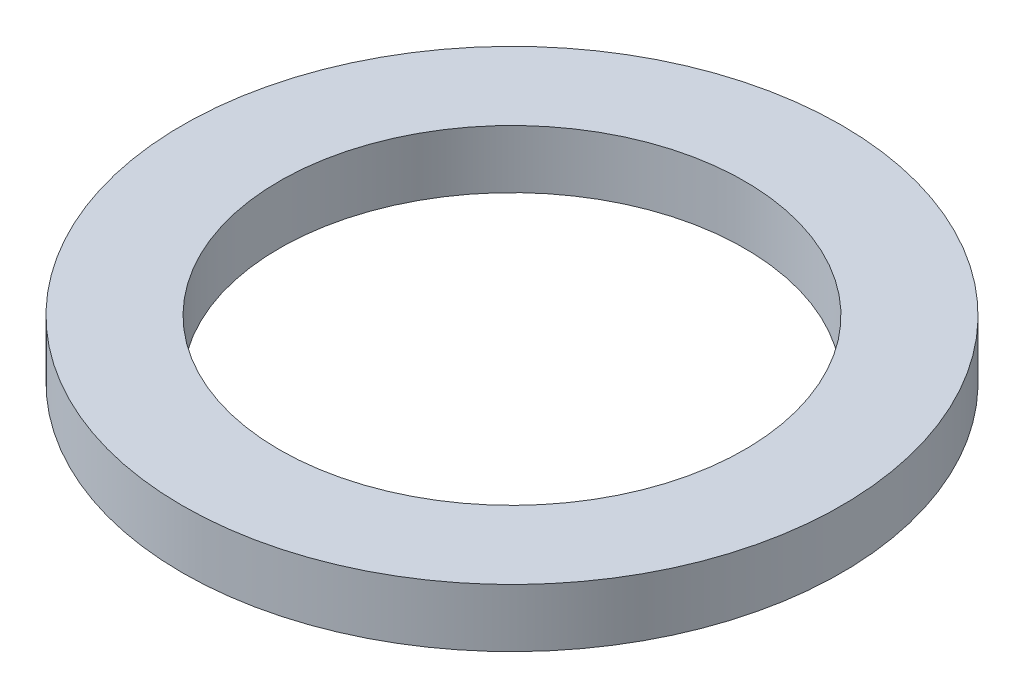
ISO-10303-21;
HEADER;
FILE_DESCRIPTION(('STEP AP214'),'2;1');
FILE_NAME('part.step','',(''),(''),'','','');
FILE_SCHEMA(('AUTOMOTIVE_DESIGN { 1 0 10303 214 1 1 1 1 }'));
ENDSEC;
DATA;
#1=APPLICATION_CONTEXT('core data for automotive mechanical design processes');
#2=APPLICATION_PROTOCOL_DEFINITION('international standard','automotive_design',2000,#1);
#3=PRODUCT_CONTEXT('',#1,'mechanical');
#4=PRODUCT('Part','Part','',(#3));
#5=PRODUCT_RELATED_PRODUCT_CATEGORY('part','',(#4));
#6=PRODUCT_DEFINITION_FORMATION('','',#4);
#7=PRODUCT_DEFINITION_CONTEXT('part definition',#1,'design');
#8=PRODUCT_DEFINITION('design','',#6,#7);
#9=PRODUCT_DEFINITION_SHAPE('','',#8);
#10=(LENGTH_UNIT() NAMED_UNIT(*) SI_UNIT(.MILLI.,.METRE.));
#11=(NAMED_UNIT(*) PLANE_ANGLE_UNIT() SI_UNIT($,.RADIAN.));
#12=(NAMED_UNIT(*) SI_UNIT($,.STERADIAN.) SOLID_ANGLE_UNIT());
#13=UNCERTAINTY_MEASURE_WITH_UNIT(LENGTH_MEASURE(1.E-05),#10,'distance_accuracy_value','');
#14=(GEOMETRIC_REPRESENTATION_CONTEXT(3) GLOBAL_UNCERTAINTY_ASSIGNED_CONTEXT((#13)) GLOBAL_UNIT_ASSIGNED_CONTEXT((#10,
#11,#12)) REPRESENTATION_CONTEXT('',''));
#15=CARTESIAN_POINT('',(0.,0.,0.));
#16=DIRECTION('',(0.,0.,1.));
#17=DIRECTION('',(1.,0.,0.));
#18=AXIS2_PLACEMENT_3D('',#15,#16,#17);
#19=CARTESIAN_POINT('',(0.,1.5,0.));
#20=DIRECTION('',(0.,1.,0.));
#21=DIRECTION('',(0.,0.,1.));
#22=AXIS2_PLACEMENT_3D('',#19,#20,#21);
#23=PLANE('',#22);
#24=CARTESIAN_POINT('',(0.,1.5,0.));
#25=DIRECTION('',(0.,1.,0.));
#26=DIRECTION('',(0.,0.,1.));
#27=AXIS2_PLACEMENT_3D('',#24,#25,#26);
#28=CIRCLE('',#27,8.5);
#29=CARTESIAN_POINT('',(0.,1.5,8.5));
#30=VERTEX_POINT('',#29);
#31=EDGE_CURVE('E10',#30,#30,#28,.T.);
#32=ORIENTED_EDGE('',*,*,#31,.T.);
#33=EDGE_LOOP('',(#32));
#34=FACE_BOUND('',#33,.T.);
#35=CARTESIAN_POINT('',(0.,1.5,0.));
#36=DIRECTION('',(0.,1.,0.));
#37=DIRECTION('',(0.,0.,1.));
#38=AXIS2_PLACEMENT_3D('',#35,#36,#37);
#39=CIRCLE('',#38,6.);
#40=CARTESIAN_POINT('',(0.,1.5,6.));
#41=VERTEX_POINT('',#40);
#42=EDGE_CURVE('E50',#41,#41,#39,.T.);
#43=ORIENTED_EDGE('',*,*,#42,.F.);
#44=EDGE_LOOP('',(#43));
#45=FACE_BOUND('',#44,.T.);
#46=ADVANCED_FACE('F37',(#34,#45),#23,.T.);
#47=CARTESIAN_POINT('',(0.,0.,0.));
#48=DIRECTION('',(0.,1.,0.));
#49=DIRECTION('',(0.,0.,1.));
#50=AXIS2_PLACEMENT_3D('',#47,#48,#49);
#51=PLANE('',#50);
#52=CARTESIAN_POINT('',(0.,0.,0.));
#53=DIRECTION('',(0.,1.,0.));
#54=DIRECTION('',(0.,0.,1.));
#55=AXIS2_PLACEMENT_3D('',#52,#53,#54);
#56=CIRCLE('',#55,8.5);
#57=CARTESIAN_POINT('',(0.,0.,8.5));
#58=VERTEX_POINT('',#57);
#59=EDGE_CURVE('E41',#58,#58,#56,.T.);
#60=ORIENTED_EDGE('',*,*,#59,.F.);
#61=EDGE_LOOP('',(#60));
#62=FACE_BOUND('',#61,.T.);
#63=CARTESIAN_POINT('',(0.,0.,0.));
#64=DIRECTION('',(0.,1.,0.));
#65=DIRECTION('',(0.,0.,1.));
#66=AXIS2_PLACEMENT_3D('',#63,#64,#65);
#67=CIRCLE('',#66,6.);
#68=CARTESIAN_POINT('',(0.,0.,6.));
#69=VERTEX_POINT('',#68);
#70=EDGE_CURVE('E52',#69,#69,#67,.T.);
#71=ORIENTED_EDGE('',*,*,#70,.T.);
#72=EDGE_LOOP('',(#71));
#73=FACE_BOUND('',#72,.T.);
#74=ADVANCED_FACE('F64',(#62,#73),#51,.F.);
#75=CARTESIAN_POINT('',(0.,1.5,0.));
#76=DIRECTION('',(0.,-1.,0.));
#77=DIRECTION('',(0.,0.,-1.));
#78=AXIS2_PLACEMENT_3D('',#75,#76,#77);
#79=CYLINDRICAL_SURFACE('',#78,8.5);
#80=ORIENTED_EDGE('',*,*,#31,.F.);
#81=EDGE_LOOP('',(#80));
#82=FACE_BOUND('',#81,.T.);
#83=ORIENTED_EDGE('',*,*,#59,.T.);
#84=EDGE_LOOP('',(#83));
#85=FACE_BOUND('',#84,.T.);
#86=ADVANCED_FACE('F39',(#82,#85),#79,.T.);
#87=CARTESIAN_POINT('',(0.,1.5,0.));
#88=DIRECTION('',(0.,-1.,0.));
#89=DIRECTION('',(0.,0.,-1.));
#90=AXIS2_PLACEMENT_3D('',#87,#88,#89);
#91=CYLINDRICAL_SURFACE('',#90,6.);
#92=ORIENTED_EDGE('',*,*,#42,.T.);
#93=EDGE_LOOP('',(#92));
#94=FACE_BOUND('',#93,.T.);
#95=ORIENTED_EDGE('',*,*,#70,.F.);
#96=EDGE_LOOP('',(#95));
#97=FACE_BOUND('',#96,.T.);
#98=ADVANCED_FACE('F60',(#94,#97),#91,.F.);
#99=CLOSED_SHELL('',(#46,#74,#86,#98));
#100=MANIFOLD_SOLID_BREP('B2',#99);
#101=ADVANCED_BREP_SHAPE_REPRESENTATION('',(#18,#100),#14);
#102=SHAPE_DEFINITION_REPRESENTATION(#9,#101);
ENDSEC;
END-ISO-10303-21;
